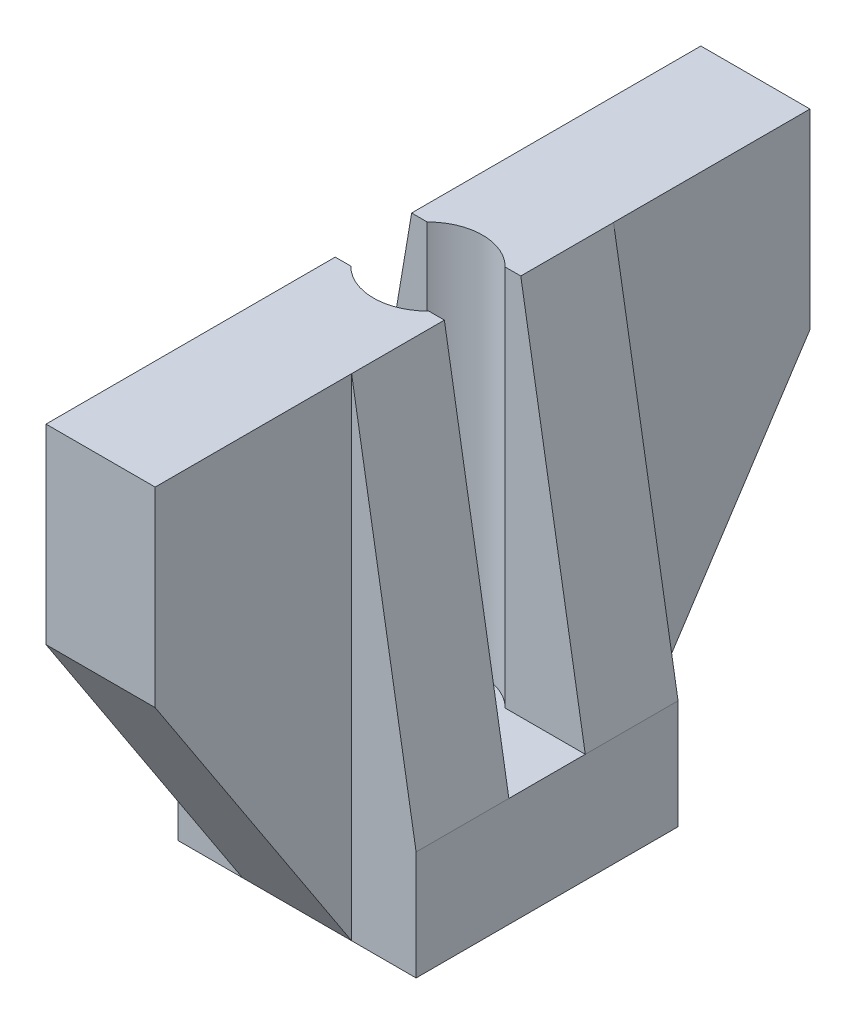
ISO-10303-21;
HEADER;
FILE_DESCRIPTION(('STEP AP214'),'2;1');
FILE_NAME('part.step','',(''),(''),'','','');
FILE_SCHEMA(('AUTOMOTIVE_DESIGN { 1 0 10303 214 1 1 1 1 }'));
ENDSEC;
DATA;
#1=APPLICATION_CONTEXT('core data for automotive mechanical design processes');
#2=APPLICATION_PROTOCOL_DEFINITION('international standard','automotive_design',2000,#1);
#3=PRODUCT_CONTEXT('',#1,'mechanical');
#4=PRODUCT('Part','Part','',(#3));
#5=PRODUCT_RELATED_PRODUCT_CATEGORY('part','',(#4));
#6=PRODUCT_DEFINITION_FORMATION('','',#4);
#7=PRODUCT_DEFINITION_CONTEXT('part definition',#1,'design');
#8=PRODUCT_DEFINITION('design','',#6,#7);
#9=PRODUCT_DEFINITION_SHAPE('','',#8);
#10=(LENGTH_UNIT() NAMED_UNIT(*) SI_UNIT(.MILLI.,.METRE.));
#11=(NAMED_UNIT(*) PLANE_ANGLE_UNIT() SI_UNIT($,.RADIAN.));
#12=(NAMED_UNIT(*) SI_UNIT($,.STERADIAN.) SOLID_ANGLE_UNIT());
#13=UNCERTAINTY_MEASURE_WITH_UNIT(LENGTH_MEASURE(1.E-05),#10,'distance_accuracy_value','');
#14=(GEOMETRIC_REPRESENTATION_CONTEXT(3) GLOBAL_UNCERTAINTY_ASSIGNED_CONTEXT((#13)) GLOBAL_UNIT_ASSIGNED_CONTEXT((#10,
#11,#12)) REPRESENTATION_CONTEXT('',''));
#15=CARTESIAN_POINT('',(0.,0.,0.));
#16=DIRECTION('',(0.,0.,1.));
#17=DIRECTION('',(1.,0.,0.));
#18=AXIS2_PLACEMENT_3D('',#15,#16,#17);
#19=CARTESIAN_POINT('',(-5.,40.,3.5));
#20=DIRECTION('',(1.,0.,0.));
#21=DIRECTION('',(0.,0.,-1.));
#22=AXIS2_PLACEMENT_3D('',#19,#20,#21);
#23=PLANE('',#22);
#24=DIRECTION('',(0.,0.,1.));
#25=VECTOR('',#24,1.);
#26=CARTESIAN_POINT('',(-5.,40.,3.5));
#27=LINE('',#26,#25);
#28=CARTESIAN_POINT('',(-5.,40.,12.));
#29=VERTEX_POINT('',#28);
#30=CARTESIAN_POINT('',(-5.,40.,30.));
#31=VERTEX_POINT('',#30);
#32=EDGE_CURVE('E372',#29,#31,#27,.T.);
#33=ORIENTED_EDGE('',*,*,#32,.F.);
#34=DIRECTION('',(0.,1.,0.));
#35=VECTOR('',#34,1.);
#36=CARTESIAN_POINT('',(-5.,5.,12.));
#37=LINE('',#36,#35);
#38=CARTESIAN_POINT('',(-5.,-5.,12.));
#39=VERTEX_POINT('',#38);
#40=EDGE_CURVE('E52',#39,#29,#37,.T.);
#41=ORIENTED_EDGE('',*,*,#40,.F.);
#42=DIRECTION('',(0.,-0.836701516894204,-0.547659174694389));
#43=VECTOR('',#42,1.);
#44=CARTESIAN_POINT('',(-5.,-5.,12.));
#45=LINE('',#44,#43);
#46=CARTESIAN_POINT('',(-5.,22.5,30.));
#47=VERTEX_POINT('',#46);
#48=EDGE_CURVE('E310',#47,#39,#45,.T.);
#49=ORIENTED_EDGE('',*,*,#48,.F.);
#50=DIRECTION('',(0.,-1.,0.));
#51=VECTOR('',#50,1.);
#52=CARTESIAN_POINT('',(-5.,40.,30.));
#53=LINE('',#52,#51);
#54=EDGE_CURVE('E382',#31,#47,#53,.T.);
#55=ORIENTED_EDGE('',*,*,#54,.F.);
#56=EDGE_LOOP('',(#33,#41,#49,#55));
#57=FACE_BOUND('',#56,.T.);
#58=ADVANCED_FACE('F36',(#57),#23,.F.);
#59=CARTESIAN_POINT('',(5.,40.,3.5));
#60=DIRECTION('',(-1.,0.,0.));
#61=DIRECTION('',(0.,0.,1.));
#62=AXIS2_PLACEMENT_3D('',#59,#60,#61);
#63=PLANE('',#62);
#64=DIRECTION('',(0.,1.,0.));
#65=VECTOR('',#64,1.);
#66=CARTESIAN_POINT('',(5.,5.,12.));
#67=LINE('',#66,#65);
#68=CARTESIAN_POINT('',(5.,-5.,12.));
#69=VERTEX_POINT('',#68);
#70=CARTESIAN_POINT('',(4.99999999999999,40.,12.));
#71=VERTEX_POINT('',#70);
#72=EDGE_CURVE('E317',#69,#71,#67,.T.);
#73=ORIENTED_EDGE('',*,*,#72,.T.);
#74=DIRECTION('',(0.,0.,-1.));
#75=VECTOR('',#74,1.);
#76=CARTESIAN_POINT('',(5.,40.,3.5));
#77=LINE('',#76,#75);
#78=CARTESIAN_POINT('',(5.,40.,30.));
#79=VERTEX_POINT('',#78);
#80=EDGE_CURVE('E222',#79,#71,#77,.T.);
#81=ORIENTED_EDGE('',*,*,#80,.F.);
#82=DIRECTION('',(0.,-1.,0.));
#83=VECTOR('',#82,1.);
#84=CARTESIAN_POINT('',(5.,40.,30.));
#85=LINE('',#84,#83);
#86=CARTESIAN_POINT('',(5.,22.5,30.));
#87=VERTEX_POINT('',#86);
#88=EDGE_CURVE('E376',#79,#87,#85,.T.);
#89=ORIENTED_EDGE('',*,*,#88,.T.);
#90=DIRECTION('',(0.,-0.836701516894204,-0.547659174694389));
#91=VECTOR('',#90,1.);
#92=CARTESIAN_POINT('',(5.,-5.,12.));
#93=LINE('',#92,#91);
#94=EDGE_CURVE('E308',#87,#69,#93,.T.);
#95=ORIENTED_EDGE('',*,*,#94,.T.);
#96=EDGE_LOOP('',(#73,#81,#89,#95));
#97=FACE_BOUND('',#96,.T.);
#98=ADVANCED_FACE('F470',(#97),#63,.F.);
#99=CARTESIAN_POINT('',(-4.99999999999999,40.,-30.));
#100=DIRECTION('',(1.,0.,0.));
#101=DIRECTION('',(0.,0.,-1.));
#102=AXIS2_PLACEMENT_3D('',#99,#100,#101);
#103=PLANE('',#102);
#104=DIRECTION('',(0.,1.,0.));
#105=VECTOR('',#104,1.);
#106=CARTESIAN_POINT('',(-5.,5.,-12.));
#107=LINE('',#106,#105);
#108=CARTESIAN_POINT('',(-5.00000000000001,-5.,-12.));
#109=VERTEX_POINT('',#108);
#110=CARTESIAN_POINT('',(-5.00000000000001,40.,-12.));
#111=VERTEX_POINT('',#110);
#112=EDGE_CURVE('E326',#109,#111,#107,.T.);
#113=ORIENTED_EDGE('',*,*,#112,.T.);
#114=DIRECTION('',(0.,0.,1.));
#115=VECTOR('',#114,1.);
#116=CARTESIAN_POINT('',(-4.99999999999999,40.,-30.));
#117=LINE('',#116,#115);
#118=CARTESIAN_POINT('',(-4.99999999999999,40.,-30.));
#119=VERTEX_POINT('',#118);
#120=EDGE_CURVE('E328',#119,#111,#117,.T.);
#121=ORIENTED_EDGE('',*,*,#120,.F.);
#122=DIRECTION('',(0.,-1.,0.));
#123=VECTOR('',#122,1.);
#124=CARTESIAN_POINT('',(-4.99999999999999,40.,-30.));
#125=LINE('',#124,#123);
#126=CARTESIAN_POINT('',(-5.,22.5,-30.));
#127=VERTEX_POINT('',#126);
#128=EDGE_CURVE('E345',#119,#127,#125,.T.);
#129=ORIENTED_EDGE('',*,*,#128,.T.);
#130=DIRECTION('',(0.,0.836701516894204,-0.547659174694389));
#131=VECTOR('',#130,1.);
#132=CARTESIAN_POINT('',(-5.00000000000001,22.5,-30.));
#133=LINE('',#132,#131);
#134=EDGE_CURVE('E321',#109,#127,#133,.T.);
#135=ORIENTED_EDGE('',*,*,#134,.F.);
#136=EDGE_LOOP('',(#113,#121,#129,#135));
#137=FACE_BOUND('',#136,.T.);
#138=ADVANCED_FACE('F476',(#137),#103,.F.);
#139=CARTESIAN_POINT('',(4.99999999999999,40.,-30.));
#140=DIRECTION('',(-1.,0.,0.));
#141=DIRECTION('',(0.,0.,1.));
#142=AXIS2_PLACEMENT_3D('',#139,#140,#141);
#143=PLANE('',#142);
#144=DIRECTION('',(0.,0.,-1.));
#145=VECTOR('',#144,1.);
#146=CARTESIAN_POINT('',(4.99999999999999,40.,-30.));
#147=LINE('',#146,#145);
#148=CARTESIAN_POINT('',(5.,40.,-12.));
#149=VERTEX_POINT('',#148);
#150=CARTESIAN_POINT('',(4.99999999999999,40.,-30.));
#151=VERTEX_POINT('',#150);
#152=EDGE_CURVE('E339',#149,#151,#147,.T.);
#153=ORIENTED_EDGE('',*,*,#152,.F.);
#154=DIRECTION('',(0.,1.,0.));
#155=VECTOR('',#154,1.);
#156=CARTESIAN_POINT('',(4.99999999999999,5.,-12.));
#157=LINE('',#156,#155);
#158=CARTESIAN_POINT('',(4.99999999999999,-5.,-12.));
#159=VERTEX_POINT('',#158);
#160=EDGE_CURVE('E60',#159,#149,#157,.T.);
#161=ORIENTED_EDGE('',*,*,#160,.F.);
#162=DIRECTION('',(0.,0.836701516894204,-0.547659174694389));
#163=VECTOR('',#162,1.);
#164=CARTESIAN_POINT('',(4.99999999999999,22.5,-30.));
#165=LINE('',#164,#163);
#166=CARTESIAN_POINT('',(5.,22.5,-30.));
#167=VERTEX_POINT('',#166);
#168=EDGE_CURVE('E320',#159,#167,#165,.T.);
#169=ORIENTED_EDGE('',*,*,#168,.T.);
#170=DIRECTION('',(0.,-1.,0.));
#171=VECTOR('',#170,1.);
#172=CARTESIAN_POINT('',(4.99999999999999,40.,-30.));
#173=LINE('',#172,#171);
#174=EDGE_CURVE('E354',#151,#167,#173,.T.);
#175=ORIENTED_EDGE('',*,*,#174,.F.);
#176=EDGE_LOOP('',(#153,#161,#169,#175));
#177=FACE_BOUND('',#176,.T.);
#178=ADVANCED_FACE('F525',(#177),#143,.F.);
#179=CARTESIAN_POINT('',(10.91,5.,12.));
#180=DIRECTION('',(0.,0.,-1.));
#181=DIRECTION('',(-1.,0.,0.));
#182=AXIS2_PLACEMENT_3D('',#179,#180,#181);
#183=PLANE('',#182);
#184=ORIENTED_EDGE('',*,*,#72,.F.);
#185=DIRECTION('',(1.,0.,0.));
#186=VECTOR('',#185,1.);
#187=CARTESIAN_POINT('',(10.91,-5.,12.));
#188=LINE('',#187,#186);
#189=CARTESIAN_POINT('',(10.91,-5.,12.));
#190=VERTEX_POINT('',#189);
#191=EDGE_CURVE('E263',#69,#190,#188,.T.);
#192=ORIENTED_EDGE('',*,*,#191,.T.);
#193=DIRECTION('',(0.,-1.,0.));
#194=VECTOR('',#193,1.);
#195=CARTESIAN_POINT('',(10.91,5.,12.));
#196=LINE('',#195,#194);
#197=CARTESIAN_POINT('',(10.91,5.,12.));
#198=VERTEX_POINT('',#197);
#199=EDGE_CURVE('E45',#198,#190,#196,.T.);
#200=ORIENTED_EDGE('',*,*,#199,.F.);
#201=DIRECTION('',(-0.166500138788965,0.986041431068318,0.));
#202=VECTOR('',#201,1.);
#203=CARTESIAN_POINT('',(10.91,5.,12.));
#204=LINE('',#203,#202);
#205=EDGE_CURVE('E240',#198,#71,#204,.T.);
#206=ORIENTED_EDGE('',*,*,#205,.T.);
#207=EDGE_LOOP('',(#184,#192,#200,#206));
#208=FACE_BOUND('',#207,.T.);
#209=ADVANCED_FACE('F520',(#208),#183,.F.);
#210=CARTESIAN_POINT('',(10.91,5.,-12.));
#211=DIRECTION('',(0.,0.,1.));
#212=DIRECTION('',(1.,0.,0.));
#213=AXIS2_PLACEMENT_3D('',#210,#211,#212);
#214=PLANE('',#213);
#215=ORIENTED_EDGE('',*,*,#112,.F.);
#216=DIRECTION('',(-1.,0.,0.));
#217=VECTOR('',#216,1.);
#218=CARTESIAN_POINT('',(10.91,-5.,-12.));
#219=LINE('',#218,#217);
#220=CARTESIAN_POINT('',(-10.91,-5.,-12.));
#221=VERTEX_POINT('',#220);
#222=EDGE_CURVE('E251',#109,#221,#219,.T.);
#223=ORIENTED_EDGE('',*,*,#222,.T.);
#224=DIRECTION('',(0.,-1.,0.));
#225=VECTOR('',#224,1.);
#226=CARTESIAN_POINT('',(-10.91,5.,-12.));
#227=LINE('',#226,#225);
#228=CARTESIAN_POINT('',(-10.91,5.,-12.));
#229=VERTEX_POINT('',#228);
#230=EDGE_CURVE('E260',#229,#221,#227,.T.);
#231=ORIENTED_EDGE('',*,*,#230,.F.);
#232=DIRECTION('',(0.166500138788964,0.986041431068318,0.));
#233=VECTOR('',#232,1.);
#234=CARTESIAN_POINT('',(-10.91,5.,-12.));
#235=LINE('',#234,#233);
#236=EDGE_CURVE('E552',#229,#111,#235,.T.);
#237=ORIENTED_EDGE('',*,*,#236,.T.);
#238=EDGE_LOOP('',(#215,#223,#231,#237));
#239=FACE_BOUND('',#238,.T.);
#240=ADVANCED_FACE('F506',(#239),#214,.F.);
#241=CARTESIAN_POINT('',(0.,5.,0.));
#242=DIRECTION('',(0.,1.,0.));
#243=DIRECTION('',(0.,0.,1.));
#244=AXIS2_PLACEMENT_3D('',#241,#242,#243);
#245=PLANE('',#244);
#246=DIRECTION('',(0.,0.,1.));
#247=VECTOR('',#246,1.);
#248=CARTESIAN_POINT('',(-10.91,5.,12.));
#249=LINE('',#248,#247);
#250=CARTESIAN_POINT('',(-10.91,5.,-3.49999999999998));
#251=VERTEX_POINT('',#250);
#252=CARTESIAN_POINT('',(-10.91,5.,3.49999999999998));
#253=VERTEX_POINT('',#252);
#254=EDGE_CURVE('E239',#251,#253,#249,.T.);
#255=ORIENTED_EDGE('',*,*,#254,.T.);
#256=DIRECTION('',(-1.,0.,0.));
#257=VECTOR('',#256,1.);
#258=CARTESIAN_POINT('',(-3.57071421427143,5.,3.5));
#259=LINE('',#258,#257);
#260=CARTESIAN_POINT('',(-3.57071421427143,5.,3.5));
#261=VERTEX_POINT('',#260);
#262=EDGE_CURVE('E211',#261,#253,#259,.T.);
#263=ORIENTED_EDGE('',*,*,#262,.F.);
#264=CARTESIAN_POINT('',(0.,5.,0.));
#265=DIRECTION('',(0.,-1.,0.));
#266=DIRECTION('',(0.,0.,1.));
#267=AXIS2_PLACEMENT_3D('',#264,#265,#266);
#268=CIRCLE('',#267,5.);
#269=CARTESIAN_POINT('',(3.57071421427143,5.,3.5));
#270=VERTEX_POINT('',#269);
#271=EDGE_CURVE('E223',#270,#261,#268,.T.);
#272=ORIENTED_EDGE('',*,*,#271,.F.);
#273=DIRECTION('',(-1.,0.,0.));
#274=VECTOR('',#273,1.);
#275=CARTESIAN_POINT('',(3.57071421427142,5.,3.5));
#276=LINE('',#275,#274);
#277=CARTESIAN_POINT('',(10.91,5.,3.49999999999998));
#278=VERTEX_POINT('',#277);
#279=EDGE_CURVE('E363',#278,#270,#276,.T.);
#280=ORIENTED_EDGE('',*,*,#279,.F.);
#281=DIRECTION('',(0.,0.,-1.));
#282=VECTOR('',#281,1.);
#283=CARTESIAN_POINT('',(10.91,5.,12.));
#284=LINE('',#283,#282);
#285=CARTESIAN_POINT('',(10.91,5.,-3.49999999999998));
#286=VERTEX_POINT('',#285);
#287=EDGE_CURVE('E250',#278,#286,#284,.T.);
#288=ORIENTED_EDGE('',*,*,#287,.T.);
#289=DIRECTION('',(1.,0.,0.));
#290=VECTOR('',#289,1.);
#291=CARTESIAN_POINT('',(3.57071421427142,5.,-3.5));
#292=LINE('',#291,#290);
#293=CARTESIAN_POINT('',(3.57071421427142,5.,-3.5));
#294=VERTEX_POINT('',#293);
#295=EDGE_CURVE('E332',#294,#286,#292,.T.);
#296=ORIENTED_EDGE('',*,*,#295,.F.);
#297=CARTESIAN_POINT('',(0.,5.,0.));
#298=DIRECTION('',(0.,-1.,0.));
#299=DIRECTION('',(0.,0.,1.));
#300=AXIS2_PLACEMENT_3D('',#297,#298,#299);
#301=CIRCLE('',#300,5.);
#302=CARTESIAN_POINT('',(-3.57071421427142,5.,-3.5));
#303=VERTEX_POINT('',#302);
#304=EDGE_CURVE('E347',#303,#294,#301,.T.);
#305=ORIENTED_EDGE('',*,*,#304,.F.);
#306=DIRECTION('',(1.,0.,0.));
#307=VECTOR('',#306,1.);
#308=CARTESIAN_POINT('',(-3.57071421427143,5.,-3.5));
#309=LINE('',#308,#307);
#310=EDGE_CURVE('E245',#251,#303,#309,.T.);
#311=ORIENTED_EDGE('',*,*,#310,.F.);
#312=EDGE_LOOP('',(#255,#263,#272,#280,#288,#296,#305,#311));
#313=FACE_BOUND('',#312,.T.);
#314=CARTESIAN_POINT('',(0.,5.,0.));
#315=DIRECTION('',(0.,1.,0.));
#316=DIRECTION('',(0.,0.,1.));
#317=AXIS2_PLACEMENT_3D('',#314,#315,#316);
#318=CIRCLE('',#317,4.15);
#319=CARTESIAN_POINT('',(0.,5.,4.15));
#320=VERTEX_POINT('',#319);
#321=EDGE_CURVE('E255',#320,#320,#318,.T.);
#322=ORIENTED_EDGE('',*,*,#321,.F.);
#323=EDGE_LOOP('',(#322));
#324=FACE_BOUND('',#323,.T.);
#325=ADVANCED_FACE('F242',(#313,#324),#245,.T.);
#326=CARTESIAN_POINT('',(0.,5.,0.));
#327=DIRECTION('',(0.,-1.,0.));
#328=DIRECTION('',(0.,0.,-1.));
#329=AXIS2_PLACEMENT_3D('',#326,#327,#328);
#330=CYLINDRICAL_SURFACE('',#329,4.15);
#331=ORIENTED_EDGE('',*,*,#321,.T.);
#332=EDGE_LOOP('',(#331));
#333=FACE_BOUND('',#332,.T.);
#334=CARTESIAN_POINT('',(0.,1.5,0.));
#335=DIRECTION('',(0.,-1.,0.));
#336=DIRECTION('',(0.,0.,-1.));
#337=AXIS2_PLACEMENT_3D('',#334,#335,#336);
#338=CIRCLE('',#337,4.15);
#339=CARTESIAN_POINT('',(0.,1.5,-4.15));
#340=VERTEX_POINT('',#339);
#341=EDGE_CURVE('E40',#340,#340,#338,.T.);
#342=ORIENTED_EDGE('',*,*,#341,.T.);
#343=EDGE_LOOP('',(#342));
#344=FACE_BOUND('',#343,.T.);
#345=ADVANCED_FACE('F509',(#333,#344),#330,.F.);
#346=CARTESIAN_POINT('',(0.,-5.,0.));
#347=DIRECTION('',(0.,1.,0.));
#348=DIRECTION('',(0.,0.,1.));
#349=AXIS2_PLACEMENT_3D('',#346,#347,#348);
#350=PLANE('',#349);
#351=DIRECTION('',(1.,0.,0.));
#352=VECTOR('',#351,1.);
#353=CARTESIAN_POINT('',(-5.,-5.,12.));
#354=LINE('',#353,#352);
#355=EDGE_CURVE('E313',#39,#69,#354,.T.);
#356=ORIENTED_EDGE('',*,*,#355,.F.);
#357=CARTESIAN_POINT('',(-10.91,-5.,12.));
#358=VERTEX_POINT('',#357);
#359=EDGE_CURVE('E264',#358,#39,#188,.T.);
#360=ORIENTED_EDGE('',*,*,#359,.F.);
#361=DIRECTION('',(0.,0.,1.));
#362=VECTOR('',#361,1.);
#363=CARTESIAN_POINT('',(-10.91,-5.,12.));
#364=LINE('',#363,#362);
#365=EDGE_CURVE('E261',#221,#358,#364,.T.);
#366=ORIENTED_EDGE('',*,*,#365,.F.);
#367=ORIENTED_EDGE('',*,*,#222,.F.);
#368=DIRECTION('',(1.,0.,0.));
#369=VECTOR('',#368,1.);
#370=CARTESIAN_POINT('',(-5.00000000000001,-5.,-12.));
#371=LINE('',#370,#369);
#372=EDGE_CURVE('E291',#109,#159,#371,.T.);
#373=ORIENTED_EDGE('',*,*,#372,.T.);
#374=CARTESIAN_POINT('',(10.91,-5.,-12.));
#375=VERTEX_POINT('',#374);
#376=EDGE_CURVE('E248',#375,#159,#219,.T.);
#377=ORIENTED_EDGE('',*,*,#376,.F.);
#378=DIRECTION('',(0.,0.,-1.));
#379=VECTOR('',#378,1.);
#380=CARTESIAN_POINT('',(10.91,-5.,12.));
#381=LINE('',#380,#379);
#382=EDGE_CURVE('E266',#190,#375,#381,.T.);
#383=ORIENTED_EDGE('',*,*,#382,.F.);
#384=ORIENTED_EDGE('',*,*,#191,.F.);
#385=EDGE_LOOP('',(#356,#360,#366,#367,#373,#377,#383,#384));
#386=FACE_BOUND('',#385,.T.);
#387=DIRECTION('',(0.5,0.,-0.866025403784439));
#388=VECTOR('',#387,1.);
#389=CARTESIAN_POINT('',(-7.79422863405995,-5.,0.));
#390=LINE('',#389,#388);
#391=CARTESIAN_POINT('',(-7.79422863405995,-5.,0.));
#392=VERTEX_POINT('',#391);
#393=CARTESIAN_POINT('',(-3.89711431702998,-5.,-6.75));
#394=VERTEX_POINT('',#393);
#395=EDGE_CURVE('E411',#392,#394,#390,.T.);
#396=ORIENTED_EDGE('',*,*,#395,.F.);
#397=DIRECTION('',(-0.5,0.,-0.866025403784439));
#398=VECTOR('',#397,1.);
#399=CARTESIAN_POINT('',(-3.89711431702997,-5.,6.75));
#400=LINE('',#399,#398);
#401=CARTESIAN_POINT('',(-3.89711431702997,-5.,6.75));
#402=VERTEX_POINT('',#401);
#403=EDGE_CURVE('E389',#402,#392,#400,.T.);
#404=ORIENTED_EDGE('',*,*,#403,.F.);
#405=DIRECTION('',(-1.,0.,0.));
#406=VECTOR('',#405,1.);
#407=CARTESIAN_POINT('',(3.89711431702998,-5.,6.75));
#408=LINE('',#407,#406);
#409=CARTESIAN_POINT('',(3.89711431702998,-5.,6.75));
#410=VERTEX_POINT('',#409);
#411=EDGE_CURVE('E394',#410,#402,#408,.T.);
#412=ORIENTED_EDGE('',*,*,#411,.F.);
#413=DIRECTION('',(-0.5,0.,0.866025403784439));
#414=VECTOR('',#413,1.);
#415=CARTESIAN_POINT('',(7.79422863405995,-5.,0.));
#416=LINE('',#415,#414);
#417=CARTESIAN_POINT('',(7.79422863405995,-5.,0.));
#418=VERTEX_POINT('',#417);
#419=EDGE_CURVE('E420',#418,#410,#416,.T.);
#420=ORIENTED_EDGE('',*,*,#419,.F.);
#421=DIRECTION('',(0.5,0.,0.866025403784439));
#422=VECTOR('',#421,1.);
#423=CARTESIAN_POINT('',(3.89711431702997,-5.,-6.75));
#424=LINE('',#423,#422);
#425=CARTESIAN_POINT('',(3.89711431702997,-5.,-6.75));
#426=VERTEX_POINT('',#425);
#427=EDGE_CURVE('E417',#426,#418,#424,.T.);
#428=ORIENTED_EDGE('',*,*,#427,.F.);
#429=DIRECTION('',(1.,0.,0.));
#430=VECTOR('',#429,1.);
#431=CARTESIAN_POINT('',(-3.89711431702998,-5.,-6.75));
#432=LINE('',#431,#430);
#433=EDGE_CURVE('E414',#394,#426,#432,.T.);
#434=ORIENTED_EDGE('',*,*,#433,.F.);
#435=EDGE_LOOP('',(#396,#404,#412,#420,#428,#434));
#436=FACE_BOUND('',#435,.T.);
#437=ADVANCED_FACE('F287',(#386,#436),#350,.F.);
#438=CARTESIAN_POINT('',(-10.91,5.,12.));
#439=DIRECTION('',(1.,0.,0.));
#440=DIRECTION('',(0.,0.,-1.));
#441=AXIS2_PLACEMENT_3D('',#438,#439,#440);
#442=PLANE('',#441);
#443=ORIENTED_EDGE('',*,*,#365,.T.);
#444=DIRECTION('',(0.,-1.,0.));
#445=VECTOR('',#444,1.);
#446=CARTESIAN_POINT('',(-10.91,5.,12.));
#447=LINE('',#446,#445);
#448=CARTESIAN_POINT('',(-10.91,5.,12.));
#449=VERTEX_POINT('',#448);
#450=EDGE_CURVE('E11',#449,#358,#447,.T.);
#451=ORIENTED_EDGE('',*,*,#450,.F.);
#452=DIRECTION('',(0.,0.,1.));
#453=VECTOR('',#452,1.);
#454=CARTESIAN_POINT('',(-10.91,5.,3.49999999999998));
#455=LINE('',#454,#453);
#456=EDGE_CURVE('E228',#253,#449,#455,.T.);
#457=ORIENTED_EDGE('',*,*,#456,.F.);
#458=ORIENTED_EDGE('',*,*,#254,.F.);
#459=EDGE_CURVE('E247',#229,#251,#249,.T.);
#460=ORIENTED_EDGE('',*,*,#459,.F.);
#461=ORIENTED_EDGE('',*,*,#230,.T.);
#462=EDGE_LOOP('',(#443,#451,#457,#458,#460,#461));
#463=FACE_BOUND('',#462,.T.);
#464=ADVANCED_FACE('F38',(#463),#442,.F.);
#465=ORIENTED_EDGE('',*,*,#359,.T.);
#466=ORIENTED_EDGE('',*,*,#40,.T.);
#467=DIRECTION('',(0.166500138788964,0.986041431068318,0.));
#468=VECTOR('',#467,1.);
#469=CARTESIAN_POINT('',(-10.91,5.,12.));
#470=LINE('',#469,#468);
#471=EDGE_CURVE('E232',#449,#29,#470,.T.);
#472=ORIENTED_EDGE('',*,*,#471,.F.);
#473=ORIENTED_EDGE('',*,*,#450,.T.);
#474=EDGE_LOOP('',(#465,#466,#472,#473));
#475=FACE_BOUND('',#474,.T.);
#476=ADVANCED_FACE('F518',(#475),#183,.F.);
#477=CARTESIAN_POINT('',(10.91,5.,12.));
#478=DIRECTION('',(-1.,0.,0.));
#479=DIRECTION('',(0.,0.,1.));
#480=AXIS2_PLACEMENT_3D('',#477,#478,#479);
#481=PLANE('',#480);
#482=ORIENTED_EDGE('',*,*,#382,.T.);
#483=DIRECTION('',(0.,-1.,0.));
#484=VECTOR('',#483,1.);
#485=CARTESIAN_POINT('',(10.91,5.,-12.));
#486=LINE('',#485,#484);
#487=CARTESIAN_POINT('',(10.91,5.,-12.));
#488=VERTEX_POINT('',#487);
#489=EDGE_CURVE('E270',#488,#375,#486,.T.);
#490=ORIENTED_EDGE('',*,*,#489,.F.);
#491=DIRECTION('',(0.,0.,-1.));
#492=VECTOR('',#491,1.);
#493=CARTESIAN_POINT('',(10.91,5.,-3.49999999999998));
#494=LINE('',#493,#492);
#495=EDGE_CURVE('E295',#286,#488,#494,.T.);
#496=ORIENTED_EDGE('',*,*,#495,.F.);
#497=ORIENTED_EDGE('',*,*,#287,.F.);
#498=EDGE_CURVE('E257',#198,#278,#284,.T.);
#499=ORIENTED_EDGE('',*,*,#498,.F.);
#500=ORIENTED_EDGE('',*,*,#199,.T.);
#501=EDGE_LOOP('',(#482,#490,#496,#497,#499,#500));
#502=FACE_BOUND('',#501,.T.);
#503=ADVANCED_FACE('F278',(#502),#481,.F.);
#504=ORIENTED_EDGE('',*,*,#376,.T.);
#505=ORIENTED_EDGE('',*,*,#160,.T.);
#506=DIRECTION('',(-0.166500138788965,0.986041431068318,0.));
#507=VECTOR('',#506,1.);
#508=CARTESIAN_POINT('',(10.91,5.,-12.));
#509=LINE('',#508,#507);
#510=EDGE_CURVE('E293',#488,#149,#509,.T.);
#511=ORIENTED_EDGE('',*,*,#510,.F.);
#512=ORIENTED_EDGE('',*,*,#489,.T.);
#513=EDGE_LOOP('',(#504,#505,#511,#512));
#514=FACE_BOUND('',#513,.T.);
#515=ADVANCED_FACE('F292',(#514),#214,.F.);
#516=CARTESIAN_POINT('',(-3.89711431702997,1.5,6.75));
#517=DIRECTION('',(-0.866025403784439,0.,0.5));
#518=DIRECTION('',(0.5,0.,0.866025403784439));
#519=AXIS2_PLACEMENT_3D('',#516,#517,#518);
#520=PLANE('',#519);
#521=ORIENTED_EDGE('',*,*,#403,.T.);
#522=DIRECTION('',(0.,-1.,0.));
#523=VECTOR('',#522,1.);
#524=CARTESIAN_POINT('',(-7.79422863405995,1.5,0.));
#525=LINE('',#524,#523);
#526=CARTESIAN_POINT('',(-7.79422863405995,1.5,0.));
#527=VERTEX_POINT('',#526);
#528=EDGE_CURVE('E409',#527,#392,#525,.T.);
#529=ORIENTED_EDGE('',*,*,#528,.F.);
#530=DIRECTION('',(-0.5,0.,-0.866025403784439));
#531=VECTOR('',#530,1.);
#532=CARTESIAN_POINT('',(-3.89711431702997,1.5,6.75));
#533=LINE('',#532,#531);
#534=CARTESIAN_POINT('',(-3.89711431702997,1.5,6.75));
#535=VERTEX_POINT('',#534);
#536=EDGE_CURVE('E390',#535,#527,#533,.T.);
#537=ORIENTED_EDGE('',*,*,#536,.F.);
#538=DIRECTION('',(0.,-1.,0.));
#539=VECTOR('',#538,1.);
#540=CARTESIAN_POINT('',(-3.89711431702997,1.5,6.75));
#541=LINE('',#540,#539);
#542=EDGE_CURVE('E425',#535,#402,#541,.T.);
#543=ORIENTED_EDGE('',*,*,#542,.T.);
#544=EDGE_LOOP('',(#521,#529,#537,#543));
#545=FACE_BOUND('',#544,.T.);
#546=ADVANCED_FACE('F453',(#545),#520,.F.);
#547=CARTESIAN_POINT('',(3.89711431702998,1.5,6.75));
#548=DIRECTION('',(0.,0.,1.));
#549=DIRECTION('',(1.,0.,0.));
#550=AXIS2_PLACEMENT_3D('',#547,#548,#549);
#551=PLANE('',#550);
#552=ORIENTED_EDGE('',*,*,#411,.T.);
#553=ORIENTED_EDGE('',*,*,#542,.F.);
#554=DIRECTION('',(-1.,0.,0.));
#555=VECTOR('',#554,1.);
#556=CARTESIAN_POINT('',(3.89711431702998,1.5,6.75));
#557=LINE('',#556,#555);
#558=CARTESIAN_POINT('',(3.89711431702998,1.5,6.75));
#559=VERTEX_POINT('',#558);
#560=EDGE_CURVE('E406',#559,#535,#557,.T.);
#561=ORIENTED_EDGE('',*,*,#560,.F.);
#562=DIRECTION('',(0.,-1.,0.));
#563=VECTOR('',#562,1.);
#564=CARTESIAN_POINT('',(3.89711431702998,1.5,6.75));
#565=LINE('',#564,#563);
#566=EDGE_CURVE('E427',#559,#410,#565,.T.);
#567=ORIENTED_EDGE('',*,*,#566,.T.);
#568=EDGE_LOOP('',(#552,#553,#561,#567));
#569=FACE_BOUND('',#568,.T.);
#570=ADVANCED_FACE('F455',(#569),#551,.F.);
#571=CARTESIAN_POINT('',(7.79422863405995,1.5,0.));
#572=DIRECTION('',(0.866025403784439,0.,0.5));
#573=DIRECTION('',(0.5,0.,-0.866025403784439));
#574=AXIS2_PLACEMENT_3D('',#571,#572,#573);
#575=PLANE('',#574);
#576=ORIENTED_EDGE('',*,*,#419,.T.);
#577=ORIENTED_EDGE('',*,*,#566,.F.);
#578=DIRECTION('',(-0.5,0.,0.866025403784439));
#579=VECTOR('',#578,1.);
#580=CARTESIAN_POINT('',(7.79422863405995,1.5,0.));
#581=LINE('',#580,#579);
#582=CARTESIAN_POINT('',(7.79422863405995,1.5,0.));
#583=VERTEX_POINT('',#582);
#584=EDGE_CURVE('E403',#583,#559,#581,.T.);
#585=ORIENTED_EDGE('',*,*,#584,.F.);
#586=DIRECTION('',(0.,-1.,0.));
#587=VECTOR('',#586,1.);
#588=CARTESIAN_POINT('',(7.79422863405995,1.5,0.));
#589=LINE('',#588,#587);
#590=EDGE_CURVE('E429',#583,#418,#589,.T.);
#591=ORIENTED_EDGE('',*,*,#590,.T.);
#592=EDGE_LOOP('',(#576,#577,#585,#591));
#593=FACE_BOUND('',#592,.T.);
#594=ADVANCED_FACE('F457',(#593),#575,.F.);
#595=CARTESIAN_POINT('',(3.89711431702997,1.5,-6.75));
#596=DIRECTION('',(0.866025403784439,0.,-0.5));
#597=DIRECTION('',(-0.5,0.,-0.866025403784439));
#598=AXIS2_PLACEMENT_3D('',#595,#596,#597);
#599=PLANE('',#598);
#600=ORIENTED_EDGE('',*,*,#427,.T.);
#601=ORIENTED_EDGE('',*,*,#590,.F.);
#602=DIRECTION('',(0.5,0.,0.866025403784439));
#603=VECTOR('',#602,1.);
#604=CARTESIAN_POINT('',(3.89711431702997,1.5,-6.75));
#605=LINE('',#604,#603);
#606=CARTESIAN_POINT('',(3.89711431702997,1.5,-6.75));
#607=VERTEX_POINT('',#606);
#608=EDGE_CURVE('E400',#607,#583,#605,.T.);
#609=ORIENTED_EDGE('',*,*,#608,.F.);
#610=DIRECTION('',(0.,-1.,0.));
#611=VECTOR('',#610,1.);
#612=CARTESIAN_POINT('',(3.89711431702997,1.5,-6.75));
#613=LINE('',#612,#611);
#614=EDGE_CURVE('E431',#607,#426,#613,.T.);
#615=ORIENTED_EDGE('',*,*,#614,.T.);
#616=EDGE_LOOP('',(#600,#601,#609,#615));
#617=FACE_BOUND('',#616,.T.);
#618=ADVANCED_FACE('F460',(#617),#599,.F.);
#619=CARTESIAN_POINT('',(-3.89711431702998,1.5,-6.75));
#620=DIRECTION('',(0.,0.,-1.));
#621=DIRECTION('',(-1.,0.,0.));
#622=AXIS2_PLACEMENT_3D('',#619,#620,#621);
#623=PLANE('',#622);
#624=ORIENTED_EDGE('',*,*,#433,.T.);
#625=ORIENTED_EDGE('',*,*,#614,.F.);
#626=DIRECTION('',(1.,0.,0.));
#627=VECTOR('',#626,1.);
#628=CARTESIAN_POINT('',(-3.89711431702998,1.5,-6.75));
#629=LINE('',#628,#627);
#630=CARTESIAN_POINT('',(-3.89711431702998,1.5,-6.75));
#631=VERTEX_POINT('',#630);
#632=EDGE_CURVE('E397',#631,#607,#629,.T.);
#633=ORIENTED_EDGE('',*,*,#632,.F.);
#634=DIRECTION('',(0.,-1.,0.));
#635=VECTOR('',#634,1.);
#636=CARTESIAN_POINT('',(-3.89711431702998,1.5,-6.75));
#637=LINE('',#636,#635);
#638=EDGE_CURVE('E433',#631,#394,#637,.T.);
#639=ORIENTED_EDGE('',*,*,#638,.T.);
#640=EDGE_LOOP('',(#624,#625,#633,#639));
#641=FACE_BOUND('',#640,.T.);
#642=ADVANCED_FACE('F447',(#641),#623,.F.);
#643=CARTESIAN_POINT('',(-7.79422863405995,1.5,0.));
#644=DIRECTION('',(-0.866025403784439,0.,-0.5));
#645=DIRECTION('',(-0.5,0.,0.866025403784439));
#646=AXIS2_PLACEMENT_3D('',#643,#644,#645);
#647=PLANE('',#646);
#648=ORIENTED_EDGE('',*,*,#395,.T.);
#649=ORIENTED_EDGE('',*,*,#638,.F.);
#650=DIRECTION('',(0.5,0.,-0.866025403784439));
#651=VECTOR('',#650,1.);
#652=CARTESIAN_POINT('',(-7.79422863405995,1.5,0.));
#653=LINE('',#652,#651);
#654=EDGE_CURVE('E393',#527,#631,#653,.T.);
#655=ORIENTED_EDGE('',*,*,#654,.F.);
#656=ORIENTED_EDGE('',*,*,#528,.T.);
#657=EDGE_LOOP('',(#648,#649,#655,#656));
#658=FACE_BOUND('',#657,.T.);
#659=ADVANCED_FACE('F438',(#658),#647,.F.);
#660=CARTESIAN_POINT('',(0.,1.5,0.));
#661=DIRECTION('',(0.,-1.,0.));
#662=DIRECTION('',(0.,0.,-1.));
#663=AXIS2_PLACEMENT_3D('',#660,#661,#662);
#664=PLANE('',#663);
#665=ORIENTED_EDGE('',*,*,#341,.F.);
#666=EDGE_LOOP('',(#665));
#667=FACE_BOUND('',#666,.T.);
#668=ORIENTED_EDGE('',*,*,#536,.T.);
#669=ORIENTED_EDGE('',*,*,#654,.T.);
#670=ORIENTED_EDGE('',*,*,#632,.T.);
#671=ORIENTED_EDGE('',*,*,#608,.T.);
#672=ORIENTED_EDGE('',*,*,#584,.T.);
#673=ORIENTED_EDGE('',*,*,#560,.T.);
#674=EDGE_LOOP('',(#668,#669,#670,#671,#672,#673));
#675=FACE_BOUND('',#674,.T.);
#676=ADVANCED_FACE('F451',(#667,#675),#664,.T.);
#677=CARTESIAN_POINT('',(3.57071421427142,40.,3.5));
#678=DIRECTION('',(0.,0.,1.));
#679=DIRECTION('',(1.,0.,0.));
#680=AXIS2_PLACEMENT_3D('',#677,#678,#679);
#681=PLANE('',#680);
#682=ORIENTED_EDGE('',*,*,#279,.T.);
#683=DIRECTION('',(0.,-1.,0.));
#684=VECTOR('',#683,1.);
#685=CARTESIAN_POINT('',(3.57071421427143,40.,3.5));
#686=LINE('',#685,#684);
#687=CARTESIAN_POINT('',(3.57071421427143,40.,3.5));
#688=VERTEX_POINT('',#687);
#689=EDGE_CURVE('E386',#688,#270,#686,.T.);
#690=ORIENTED_EDGE('',*,*,#689,.F.);
#691=DIRECTION('',(-1.,0.,0.));
#692=VECTOR('',#691,1.);
#693=CARTESIAN_POINT('',(3.57071421427142,40.,3.5));
#694=LINE('',#693,#692);
#695=CARTESIAN_POINT('',(5.,40.,3.5));
#696=VERTEX_POINT('',#695);
#697=EDGE_CURVE('E366',#696,#688,#694,.T.);
#698=ORIENTED_EDGE('',*,*,#697,.F.);
#699=DIRECTION('',(-0.166500138788965,0.986041431068318,0.));
#700=VECTOR('',#699,1.);
#701=CARTESIAN_POINT('',(10.91,5.,3.49999999999998));
#702=LINE('',#701,#700);
#703=EDGE_CURVE('E541',#278,#696,#702,.T.);
#704=ORIENTED_EDGE('',*,*,#703,.F.);
#705=EDGE_LOOP('',(#682,#690,#698,#704));
#706=FACE_BOUND('',#705,.T.);
#707=ADVANCED_FACE('F489',(#706),#681,.F.);
#708=CARTESIAN_POINT('',(0.,40.,0.));
#709=DIRECTION('',(0.,-1.,0.));
#710=DIRECTION('',(0.,0.,-1.));
#711=AXIS2_PLACEMENT_3D('',#708,#709,#710);
#712=CYLINDRICAL_SURFACE('',#711,5.);
#713=ORIENTED_EDGE('',*,*,#271,.T.);
#714=DIRECTION('',(0.,-1.,0.));
#715=VECTOR('',#714,1.);
#716=CARTESIAN_POINT('',(-3.57071421427143,40.,3.5));
#717=LINE('',#716,#715);
#718=CARTESIAN_POINT('',(-3.57071421427143,40.,3.5));
#719=VERTEX_POINT('',#718);
#720=EDGE_CURVE('E218',#719,#261,#717,.T.);
#721=ORIENTED_EDGE('',*,*,#720,.F.);
#722=CARTESIAN_POINT('',(0.,40.,0.));
#723=DIRECTION('',(0.,-1.,0.));
#724=DIRECTION('',(0.,0.,1.));
#725=AXIS2_PLACEMENT_3D('',#722,#723,#724);
#726=CIRCLE('',#725,5.);
#727=EDGE_CURVE('E368',#688,#719,#726,.T.);
#728=ORIENTED_EDGE('',*,*,#727,.F.);
#729=ORIENTED_EDGE('',*,*,#689,.T.);
#730=EDGE_LOOP('',(#713,#721,#728,#729));
#731=FACE_BOUND('',#730,.T.);
#732=ADVANCED_FACE('F486',(#731),#712,.F.);
#733=CARTESIAN_POINT('',(-3.57071421427143,40.,3.5));
#734=DIRECTION('',(0.,0.,1.));
#735=DIRECTION('',(1.,0.,0.));
#736=AXIS2_PLACEMENT_3D('',#733,#734,#735);
#737=PLANE('',#736);
#738=ORIENTED_EDGE('',*,*,#262,.T.);
#739=DIRECTION('',(0.166500138788964,0.986041431068318,0.));
#740=VECTOR('',#739,1.);
#741=CARTESIAN_POINT('',(-10.91,5.,3.49999999999998));
#742=LINE('',#741,#740);
#743=CARTESIAN_POINT('',(-5.00000000000001,40.,3.49999999999998));
#744=VERTEX_POINT('',#743);
#745=EDGE_CURVE('E215',#253,#744,#742,.T.);
#746=ORIENTED_EDGE('',*,*,#745,.T.);
#747=DIRECTION('',(-1.,0.,0.));
#748=VECTOR('',#747,1.);
#749=CARTESIAN_POINT('',(-3.57071421427143,40.,3.5));
#750=LINE('',#749,#748);
#751=EDGE_CURVE('E370',#719,#744,#750,.T.);
#752=ORIENTED_EDGE('',*,*,#751,.F.);
#753=ORIENTED_EDGE('',*,*,#720,.T.);
#754=EDGE_LOOP('',(#738,#746,#752,#753));
#755=FACE_BOUND('',#754,.T.);
#756=ADVANCED_FACE('F213',(#755),#737,.F.);
#757=CARTESIAN_POINT('',(-5.,40.,30.));
#758=DIRECTION('',(0.,0.,-1.));
#759=DIRECTION('',(-1.,0.,0.));
#760=AXIS2_PLACEMENT_3D('',#757,#758,#759);
#761=PLANE('',#760);
#762=ORIENTED_EDGE('',*,*,#54,.T.);
#763=DIRECTION('',(1.,0.,0.));
#764=VECTOR('',#763,1.);
#765=CARTESIAN_POINT('',(-5.,22.5,30.));
#766=LINE('',#765,#764);
#767=EDGE_CURVE('E302',#47,#87,#766,.T.);
#768=ORIENTED_EDGE('',*,*,#767,.T.);
#769=ORIENTED_EDGE('',*,*,#88,.F.);
#770=DIRECTION('',(1.,0.,0.));
#771=VECTOR('',#770,1.);
#772=CARTESIAN_POINT('',(-5.,40.,30.));
#773=LINE('',#772,#771);
#774=EDGE_CURVE('E374',#31,#79,#773,.T.);
#775=ORIENTED_EDGE('',*,*,#774,.F.);
#776=EDGE_LOOP('',(#762,#768,#769,#775));
#777=FACE_BOUND('',#776,.T.);
#778=ADVANCED_FACE('F482',(#777),#761,.F.);
#779=CARTESIAN_POINT('',(0.,40.,0.));
#780=DIRECTION('',(0.,1.,0.));
#781=DIRECTION('',(0.,0.,1.));
#782=AXIS2_PLACEMENT_3D('',#779,#780,#781);
#783=PLANE('',#782);
#784=ORIENTED_EDGE('',*,*,#80,.T.);
#785=DIRECTION('',(0.,0.,1.));
#786=VECTOR('',#785,1.);
#787=CARTESIAN_POINT('',(4.99999999999999,40.,3.49999999999998));
#788=LINE('',#787,#786);
#789=EDGE_CURVE('E538',#696,#71,#788,.T.);
#790=ORIENTED_EDGE('',*,*,#789,.F.);
#791=ORIENTED_EDGE('',*,*,#697,.T.);
#792=ORIENTED_EDGE('',*,*,#727,.T.);
#793=ORIENTED_EDGE('',*,*,#751,.T.);
#794=EDGE_CURVE('E230',#744,#29,#27,.T.);
#795=ORIENTED_EDGE('',*,*,#794,.T.);
#796=ORIENTED_EDGE('',*,*,#32,.T.);
#797=ORIENTED_EDGE('',*,*,#774,.T.);
#798=EDGE_LOOP('',(#784,#790,#791,#792,#793,#795,#796,#797));
#799=FACE_BOUND('',#798,.T.);
#800=ADVANCED_FACE('F591',(#799),#783,.T.);
#801=CARTESIAN_POINT('',(-3.57071421427143,40.,-3.5));
#802=DIRECTION('',(0.,0.,-1.));
#803=DIRECTION('',(-1.,0.,0.));
#804=AXIS2_PLACEMENT_3D('',#801,#802,#803);
#805=PLANE('',#804);
#806=ORIENTED_EDGE('',*,*,#310,.T.);
#807=DIRECTION('',(0.,-1.,0.));
#808=VECTOR('',#807,1.);
#809=CARTESIAN_POINT('',(-3.57071421427142,40.,-3.5));
#810=LINE('',#809,#808);
#811=CARTESIAN_POINT('',(-3.57071421427142,40.,-3.5));
#812=VERTEX_POINT('',#811);
#813=EDGE_CURVE('E360',#812,#303,#810,.T.);
#814=ORIENTED_EDGE('',*,*,#813,.F.);
#815=DIRECTION('',(1.,0.,0.));
#816=VECTOR('',#815,1.);
#817=CARTESIAN_POINT('',(-3.57071421427143,40.,-3.5));
#818=LINE('',#817,#816);
#819=CARTESIAN_POINT('',(-5.,40.,-3.5));
#820=VERTEX_POINT('',#819);
#821=EDGE_CURVE('E331',#820,#812,#818,.T.);
#822=ORIENTED_EDGE('',*,*,#821,.F.);
#823=DIRECTION('',(0.166500138788964,0.986041431068318,0.));
#824=VECTOR('',#823,1.);
#825=CARTESIAN_POINT('',(-10.91,5.,-3.49999999999998));
#826=LINE('',#825,#824);
#827=EDGE_CURVE('E547',#251,#820,#826,.T.);
#828=ORIENTED_EDGE('',*,*,#827,.F.);
#829=EDGE_LOOP('',(#806,#814,#822,#828));
#830=FACE_BOUND('',#829,.T.);
#831=ADVANCED_FACE('F565',(#830),#805,.F.);
#832=CARTESIAN_POINT('',(0.,40.,0.));
#833=DIRECTION('',(0.,-1.,0.));
#834=DIRECTION('',(0.,0.,-1.));
#835=AXIS2_PLACEMENT_3D('',#832,#833,#834);
#836=CYLINDRICAL_SURFACE('',#835,5.);
#837=ORIENTED_EDGE('',*,*,#304,.T.);
#838=DIRECTION('',(0.,-1.,0.));
#839=VECTOR('',#838,1.);
#840=CARTESIAN_POINT('',(3.57071421427142,40.,-3.5));
#841=LINE('',#840,#839);
#842=CARTESIAN_POINT('',(3.57071421427142,40.,-3.5));
#843=VERTEX_POINT('',#842);
#844=EDGE_CURVE('E357',#843,#294,#841,.T.);
#845=ORIENTED_EDGE('',*,*,#844,.F.);
#846=CARTESIAN_POINT('',(0.,40.,0.));
#847=DIRECTION('',(0.,-1.,0.));
#848=DIRECTION('',(0.,0.,1.));
#849=AXIS2_PLACEMENT_3D('',#846,#847,#848);
#850=CIRCLE('',#849,5.);
#851=EDGE_CURVE('E334',#812,#843,#850,.T.);
#852=ORIENTED_EDGE('',*,*,#851,.F.);
#853=ORIENTED_EDGE('',*,*,#813,.T.);
#854=EDGE_LOOP('',(#837,#845,#852,#853));
#855=FACE_BOUND('',#854,.T.);
#856=ADVANCED_FACE('F569',(#855),#836,.F.);
#857=CARTESIAN_POINT('',(3.57071421427142,40.,-3.5));
#858=DIRECTION('',(0.,0.,-1.));
#859=DIRECTION('',(-1.,0.,0.));
#860=AXIS2_PLACEMENT_3D('',#857,#858,#859);
#861=PLANE('',#860);
#862=ORIENTED_EDGE('',*,*,#295,.T.);
#863=DIRECTION('',(-0.166500138788965,0.986041431068318,0.));
#864=VECTOR('',#863,1.);
#865=CARTESIAN_POINT('',(10.91,5.,-3.49999999999998));
#866=LINE('',#865,#864);
#867=CARTESIAN_POINT('',(4.99999999999999,40.,-3.49999999999998));
#868=VERTEX_POINT('',#867);
#869=EDGE_CURVE('E299',#286,#868,#866,.T.);
#870=ORIENTED_EDGE('',*,*,#869,.T.);
#871=DIRECTION('',(1.,0.,0.));
#872=VECTOR('',#871,1.);
#873=CARTESIAN_POINT('',(3.57071421427142,40.,-3.5));
#874=LINE('',#873,#872);
#875=EDGE_CURVE('E336',#843,#868,#874,.T.);
#876=ORIENTED_EDGE('',*,*,#875,.F.);
#877=ORIENTED_EDGE('',*,*,#844,.T.);
#878=EDGE_LOOP('',(#862,#870,#876,#877));
#879=FACE_BOUND('',#878,.T.);
#880=ADVANCED_FACE('F573',(#879),#861,.F.);
#881=CARTESIAN_POINT('',(-4.99999999999999,40.,-30.));
#882=DIRECTION('',(0.,0.,1.));
#883=DIRECTION('',(1.,0.,0.));
#884=AXIS2_PLACEMENT_3D('',#881,#882,#883);
#885=PLANE('',#884);
#886=ORIENTED_EDGE('',*,*,#174,.T.);
#887=DIRECTION('',(1.,0.,0.));
#888=VECTOR('',#887,1.);
#889=CARTESIAN_POINT('',(-5.,22.5,-30.));
#890=LINE('',#889,#888);
#891=EDGE_CURVE('E298',#127,#167,#890,.T.);
#892=ORIENTED_EDGE('',*,*,#891,.F.);
#893=ORIENTED_EDGE('',*,*,#128,.F.);
#894=DIRECTION('',(-1.,0.,0.));
#895=VECTOR('',#894,1.);
#896=CARTESIAN_POINT('',(-4.99999999999999,40.,-30.));
#897=LINE('',#896,#895);
#898=EDGE_CURVE('E343',#151,#119,#897,.T.);
#899=ORIENTED_EDGE('',*,*,#898,.F.);
#900=EDGE_LOOP('',(#886,#892,#893,#899));
#901=FACE_BOUND('',#900,.T.);
#902=ADVANCED_FACE('F582',(#901),#885,.F.);
#903=CARTESIAN_POINT('',(0.,40.,0.));
#904=DIRECTION('',(0.,1.,0.));
#905=DIRECTION('',(0.,0.,1.));
#906=AXIS2_PLACEMENT_3D('',#903,#904,#905);
#907=PLANE('',#906);
#908=ORIENTED_EDGE('',*,*,#120,.T.);
#909=DIRECTION('',(0.,0.,-1.));
#910=VECTOR('',#909,1.);
#911=CARTESIAN_POINT('',(-5.00000000000001,40.,-3.49999999999998));
#912=LINE('',#911,#910);
#913=EDGE_CURVE('E544',#820,#111,#912,.T.);
#914=ORIENTED_EDGE('',*,*,#913,.F.);
#915=ORIENTED_EDGE('',*,*,#821,.T.);
#916=ORIENTED_EDGE('',*,*,#851,.T.);
#917=ORIENTED_EDGE('',*,*,#875,.T.);
#918=EDGE_CURVE('E340',#868,#149,#147,.T.);
#919=ORIENTED_EDGE('',*,*,#918,.T.);
#920=ORIENTED_EDGE('',*,*,#152,.T.);
#921=ORIENTED_EDGE('',*,*,#898,.T.);
#922=EDGE_LOOP('',(#908,#914,#915,#916,#917,#919,#920,#921));
#923=FACE_BOUND('',#922,.T.);
#924=ADVANCED_FACE('F562',(#923),#907,.T.);
#925=CARTESIAN_POINT('',(-5.00000000000001,22.5,-30.));
#926=DIRECTION('',(0.,-0.547659174694389,-0.836701516894204));
#927=DIRECTION('',(0.,0.836701516894204,-0.547659174694389));
#928=AXIS2_PLACEMENT_3D('',#925,#926,#927);
#929=PLANE('',#928);
#930=ORIENTED_EDGE('',*,*,#134,.T.);
#931=ORIENTED_EDGE('',*,*,#891,.T.);
#932=ORIENTED_EDGE('',*,*,#168,.F.);
#933=ORIENTED_EDGE('',*,*,#372,.F.);
#934=EDGE_LOOP('',(#930,#931,#932,#933));
#935=FACE_BOUND('',#934,.T.);
#936=ADVANCED_FACE('F612',(#935),#929,.T.);
#937=CARTESIAN_POINT('',(-5.,-5.,12.));
#938=DIRECTION('',(0.,-0.547659174694389,0.836701516894204));
#939=DIRECTION('',(0.,-0.836701516894204,-0.547659174694389));
#940=AXIS2_PLACEMENT_3D('',#937,#938,#939);
#941=PLANE('',#940);
#942=ORIENTED_EDGE('',*,*,#94,.F.);
#943=ORIENTED_EDGE('',*,*,#767,.F.);
#944=ORIENTED_EDGE('',*,*,#48,.T.);
#945=ORIENTED_EDGE('',*,*,#355,.T.);
#946=EDGE_LOOP('',(#942,#943,#944,#945));
#947=FACE_BOUND('',#946,.T.);
#948=ADVANCED_FACE('F615',(#947),#941,.T.);
#949=CARTESIAN_POINT('',(10.91,5.,-3.49999999999998));
#950=DIRECTION('',(-0.986041431068318,-0.166500138788965,0.));
#951=DIRECTION('',(0.166500138788965,-0.986041431068317,0.));
#952=AXIS2_PLACEMENT_3D('',#949,#950,#951);
#953=PLANE('',#952);
#954=ORIENTED_EDGE('',*,*,#510,.T.);
#955=ORIENTED_EDGE('',*,*,#918,.F.);
#956=ORIENTED_EDGE('',*,*,#869,.F.);
#957=ORIENTED_EDGE('',*,*,#495,.T.);
#958=EDGE_LOOP('',(#954,#955,#956,#957));
#959=FACE_BOUND('',#958,.T.);
#960=ADVANCED_FACE('F574',(#959),#953,.F.);
#961=CARTESIAN_POINT('',(-10.91,5.,-3.49999999999998));
#962=DIRECTION('',(-0.986041431068318,0.166500138788964,0.));
#963=DIRECTION('',(-0.166500138788964,-0.986041431068318,0.));
#964=AXIS2_PLACEMENT_3D('',#961,#962,#963);
#965=PLANE('',#964);
#966=ORIENTED_EDGE('',*,*,#236,.F.);
#967=ORIENTED_EDGE('',*,*,#459,.T.);
#968=ORIENTED_EDGE('',*,*,#827,.T.);
#969=ORIENTED_EDGE('',*,*,#913,.T.);
#970=EDGE_LOOP('',(#966,#967,#968,#969));
#971=FACE_BOUND('',#970,.T.);
#972=ADVANCED_FACE('F558',(#971),#965,.T.);
#973=CARTESIAN_POINT('',(10.91,5.,3.49999999999998));
#974=DIRECTION('',(0.986041431068318,0.166500138788965,0.));
#975=DIRECTION('',(-0.166500138788965,0.986041431068317,0.));
#976=AXIS2_PLACEMENT_3D('',#973,#974,#975);
#977=PLANE('',#976);
#978=ORIENTED_EDGE('',*,*,#205,.F.);
#979=ORIENTED_EDGE('',*,*,#498,.T.);
#980=ORIENTED_EDGE('',*,*,#703,.T.);
#981=ORIENTED_EDGE('',*,*,#789,.T.);
#982=EDGE_LOOP('',(#978,#979,#980,#981));
#983=FACE_BOUND('',#982,.T.);
#984=ADVANCED_FACE('F539',(#983),#977,.T.);
#985=CARTESIAN_POINT('',(-10.91,5.,3.49999999999998));
#986=DIRECTION('',(0.986041431068318,-0.166500138788964,0.));
#987=DIRECTION('',(0.166500138788964,0.986041431068318,0.));
#988=AXIS2_PLACEMENT_3D('',#985,#986,#987);
#989=PLANE('',#988);
#990=ORIENTED_EDGE('',*,*,#471,.T.);
#991=ORIENTED_EDGE('',*,*,#794,.F.);
#992=ORIENTED_EDGE('',*,*,#745,.F.);
#993=ORIENTED_EDGE('',*,*,#456,.T.);
#994=EDGE_LOOP('',(#990,#991,#992,#993));
#995=FACE_BOUND('',#994,.T.);
#996=ADVANCED_FACE('F227',(#995),#989,.F.);
#997=CLOSED_SHELL('',(#58,#98,#138,#178,#209,#240,#325,#345,#437,#464,#476,#503,#515,#546,#570,
#594,#618,#642,#659,#676,#707,#732,#756,#778,#800,#831,#856,#880,#902,#924,#936,#948,#960,#972,
#984,#996));
#998=MANIFOLD_SOLID_BREP('B2',#997);
#999=ADVANCED_BREP_SHAPE_REPRESENTATION('',(#18,#998),#14);
#1000=SHAPE_DEFINITION_REPRESENTATION(#9,#999);
ENDSEC;
END-ISO-10303-21;
